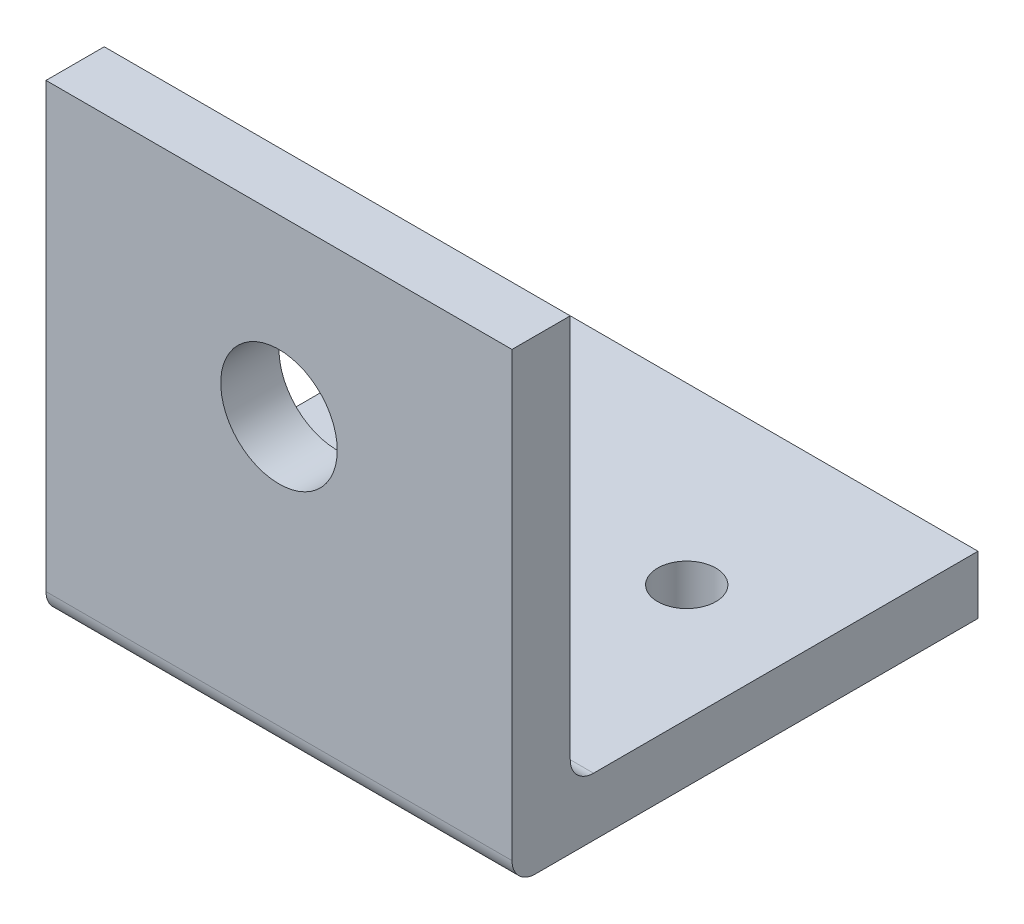
ISO-10303-21;
HEADER;
FILE_DESCRIPTION(('STEP AP214'),'2;1');
FILE_NAME('part.step','',(''),(''),'','','');
FILE_SCHEMA(('AUTOMOTIVE_DESIGN { 1 0 10303 214 1 1 1 1 }'));
ENDSEC;
DATA;
#1=APPLICATION_CONTEXT('core data for automotive mechanical design processes');
#2=APPLICATION_PROTOCOL_DEFINITION('international standard','automotive_design',2000,#1);
#3=PRODUCT_CONTEXT('',#1,'mechanical');
#4=PRODUCT('Part','Part','',(#3));
#5=PRODUCT_RELATED_PRODUCT_CATEGORY('part','',(#4));
#6=PRODUCT_DEFINITION_FORMATION('','',#4);
#7=PRODUCT_DEFINITION_CONTEXT('part definition',#1,'design');
#8=PRODUCT_DEFINITION('design','',#6,#7);
#9=PRODUCT_DEFINITION_SHAPE('','',#8);
#10=(LENGTH_UNIT() NAMED_UNIT(*) SI_UNIT(.MILLI.,.METRE.));
#11=(NAMED_UNIT(*) PLANE_ANGLE_UNIT() SI_UNIT($,.RADIAN.));
#12=(NAMED_UNIT(*) SI_UNIT($,.STERADIAN.) SOLID_ANGLE_UNIT());
#13=UNCERTAINTY_MEASURE_WITH_UNIT(LENGTH_MEASURE(1.E-05),#10,'distance_accuracy_value','');
#14=(GEOMETRIC_REPRESENTATION_CONTEXT(3) GLOBAL_UNCERTAINTY_ASSIGNED_CONTEXT((#13)) GLOBAL_UNIT_ASSIGNED_CONTEXT((#10,
#11,#12)) REPRESENTATION_CONTEXT('',''));
#15=CARTESIAN_POINT('',(0.,0.,0.));
#16=DIRECTION('',(0.,0.,1.));
#17=DIRECTION('',(1.,0.,0.));
#18=AXIS2_PLACEMENT_3D('',#15,#16,#17);
#19=CARTESIAN_POINT('',(40.,38.6433087460485,17.895679662803));
#20=DIRECTION('',(0.,-1.,0.));
#21=DIRECTION('',(0.,0.,-1.));
#22=AXIS2_PLACEMENT_3D('',#19,#20,#21);
#23=PLANE('',#22);
#24=DIRECTION('',(0.,0.,1.));
#25=VECTOR('',#24,1.);
#26=CARTESIAN_POINT('',(0.,38.6433087460485,17.895679662803));
#27=LINE('',#26,#25);
#28=CARTESIAN_POINT('',(0.,38.6433087460485,12.895679662803));
#29=VERTEX_POINT('',#28);
#30=CARTESIAN_POINT('',(0.,38.6433087460485,17.895679662803));
#31=VERTEX_POINT('',#30);
#32=EDGE_CURVE('E137',#29,#31,#27,.T.);
#33=ORIENTED_EDGE('',*,*,#32,.T.);
#34=DIRECTION('',(-1.,0.,0.));
#35=VECTOR('',#34,1.);
#36=CARTESIAN_POINT('',(40.,38.6433087460485,17.895679662803));
#37=LINE('',#36,#35);
#38=CARTESIAN_POINT('',(40.,38.6433087460485,17.895679662803));
#39=VERTEX_POINT('',#38);
#40=EDGE_CURVE('E116',#39,#31,#37,.T.);
#41=ORIENTED_EDGE('',*,*,#40,.F.);
#42=DIRECTION('',(0.,0.,1.));
#43=VECTOR('',#42,1.);
#44=CARTESIAN_POINT('',(40.,38.6433087460485,17.895679662803));
#45=LINE('',#44,#43);
#46=CARTESIAN_POINT('',(40.,38.6433087460485,12.895679662803));
#47=VERTEX_POINT('',#46);
#48=EDGE_CURVE('E124',#47,#39,#45,.T.);
#49=ORIENTED_EDGE('',*,*,#48,.F.);
#50=DIRECTION('',(-1.,0.,0.));
#51=VECTOR('',#50,1.);
#52=CARTESIAN_POINT('',(40.,38.6433087460485,12.895679662803));
#53=LINE('',#52,#51);
#54=EDGE_CURVE('E163',#47,#29,#53,.T.);
#55=ORIENTED_EDGE('',*,*,#54,.T.);
#56=EDGE_LOOP('',(#33,#41,#49,#55));
#57=FACE_BOUND('',#56,.T.);
#58=ADVANCED_FACE('F45',(#57),#23,.F.);
#59=CARTESIAN_POINT('',(40.,38.6433087460485,17.895679662803));
#60=DIRECTION('',(0.,0.,-1.));
#61=DIRECTION('',(0.,1.,0.));
#62=AXIS2_PLACEMENT_3D('',#59,#60,#61);
#63=PLANE('',#62);
#64=CARTESIAN_POINT('',(20.,23.6433087460485,17.895679662803));
#65=DIRECTION('',(0.,0.,1.));
#66=DIRECTION('',(1.,0.,0.));
#67=AXIS2_PLACEMENT_3D('',#64,#65,#66);
#68=CIRCLE('',#67,5.);
#69=CARTESIAN_POINT('',(25.,23.6433087460485,17.895679662803));
#70=VERTEX_POINT('',#69);
#71=EDGE_CURVE('E198',#70,#70,#68,.T.);
#72=ORIENTED_EDGE('',*,*,#71,.F.);
#73=EDGE_LOOP('',(#72));
#74=FACE_BOUND('',#73,.T.);
#75=DIRECTION('',(0.,-1.,0.));
#76=VECTOR('',#75,1.);
#77=CARTESIAN_POINT('',(0.,38.6433087460485,17.895679662803));
#78=LINE('',#77,#76);
#79=CARTESIAN_POINT('',(0.,0.643308746048472,17.895679662803));
#80=VERTEX_POINT('',#79);
#81=EDGE_CURVE('E180',#31,#80,#78,.T.);
#82=ORIENTED_EDGE('',*,*,#81,.T.);
#83=DIRECTION('',(-1.,0.,0.));
#84=VECTOR('',#83,1.);
#85=CARTESIAN_POINT('',(40.,0.643308746048472,17.895679662803));
#86=LINE('',#85,#84);
#87=CARTESIAN_POINT('',(40.,0.643308746048472,17.895679662803));
#88=VERTEX_POINT('',#87);
#89=EDGE_CURVE('E119',#88,#80,#86,.T.);
#90=ORIENTED_EDGE('',*,*,#89,.F.);
#91=DIRECTION('',(0.,-1.,0.));
#92=VECTOR('',#91,1.);
#93=CARTESIAN_POINT('',(40.,38.6433087460485,17.895679662803));
#94=LINE('',#93,#92);
#95=EDGE_CURVE('E112',#39,#88,#94,.T.);
#96=ORIENTED_EDGE('',*,*,#95,.F.);
#97=ORIENTED_EDGE('',*,*,#40,.T.);
#98=EDGE_LOOP('',(#82,#90,#96,#97));
#99=FACE_BOUND('',#98,.T.);
#100=ADVANCED_FACE('F114',(#74,#99),#63,.F.);
#101=CARTESIAN_POINT('',(40.,0.643308746048472,15.895679662803));
#102=DIRECTION('',(-1.,0.,0.));
#103=DIRECTION('',(0.,0.,1.));
#104=AXIS2_PLACEMENT_3D('',#101,#102,#103);
#105=CYLINDRICAL_SURFACE('',#104,2.);
#106=CARTESIAN_POINT('',(0.,0.643308746048472,15.895679662803));
#107=DIRECTION('',(1.,0.,0.));
#108=DIRECTION('',(0.,0.,-1.));
#109=AXIS2_PLACEMENT_3D('',#106,#107,#108);
#110=CIRCLE('',#109,2.);
#111=CARTESIAN_POINT('',(0.,-1.35669125395153,15.895679662803));
#112=VERTEX_POINT('',#111);
#113=EDGE_CURVE('E177',#80,#112,#110,.T.);
#114=ORIENTED_EDGE('',*,*,#113,.T.);
#115=DIRECTION('',(-1.,0.,0.));
#116=VECTOR('',#115,1.);
#117=CARTESIAN_POINT('',(40.,-1.35669125395153,15.895679662803));
#118=LINE('',#117,#116);
#119=CARTESIAN_POINT('',(40.,-1.35669125395153,15.895679662803));
#120=VERTEX_POINT('',#119);
#121=EDGE_CURVE('E145',#120,#112,#118,.T.);
#122=ORIENTED_EDGE('',*,*,#121,.F.);
#123=CARTESIAN_POINT('',(40.,0.643308746048472,15.895679662803));
#124=DIRECTION('',(1.,0.,0.));
#125=DIRECTION('',(0.,0.,-1.));
#126=AXIS2_PLACEMENT_3D('',#123,#124,#125);
#127=CIRCLE('',#126,2.);
#128=EDGE_CURVE('E123',#88,#120,#127,.T.);
#129=ORIENTED_EDGE('',*,*,#128,.F.);
#130=ORIENTED_EDGE('',*,*,#89,.T.);
#131=EDGE_LOOP('',(#114,#122,#129,#130));
#132=FACE_BOUND('',#131,.T.);
#133=ADVANCED_FACE('F246',(#132),#105,.T.);
#134=CARTESIAN_POINT('',(40.,-1.35669125395153,15.895679662803));
#135=DIRECTION('',(0.,1.,0.));
#136=DIRECTION('',(0.,0.,1.));
#137=AXIS2_PLACEMENT_3D('',#134,#135,#136);
#138=PLANE('',#137);
#139=CARTESIAN_POINT('',(10.,-1.35669125395153,-7.10432033719703));
#140=DIRECTION('',(0.,1.,0.));
#141=DIRECTION('',(0.,0.,1.));
#142=AXIS2_PLACEMENT_3D('',#139,#140,#141);
#143=CIRCLE('',#142,2.5);
#144=CARTESIAN_POINT('',(10.,-1.35669125395153,-4.60432033719703));
#145=VERTEX_POINT('',#144);
#146=EDGE_CURVE('E202',#145,#145,#143,.T.);
#147=ORIENTED_EDGE('',*,*,#146,.T.);
#148=EDGE_LOOP('',(#147));
#149=FACE_BOUND('',#148,.T.);
#150=CARTESIAN_POINT('',(30.,-1.35669125395153,-7.10432033719703));
#151=DIRECTION('',(0.,1.,0.));
#152=DIRECTION('',(0.,0.,1.));
#153=AXIS2_PLACEMENT_3D('',#150,#151,#152);
#154=CIRCLE('',#153,2.49999999999999);
#155=CARTESIAN_POINT('',(30.,-1.35669125395153,-4.60432033719704));
#156=VERTEX_POINT('',#155);
#157=EDGE_CURVE('E203',#156,#156,#154,.T.);
#158=ORIENTED_EDGE('',*,*,#157,.T.);
#159=EDGE_LOOP('',(#158));
#160=FACE_BOUND('',#159,.T.);
#161=DIRECTION('',(0.,0.,-1.));
#162=VECTOR('',#161,1.);
#163=CARTESIAN_POINT('',(0.,-1.35669125395153,15.895679662803));
#164=LINE('',#163,#162);
#165=CARTESIAN_POINT('',(0.,-1.35669125395153,-22.104320337197));
#166=VERTEX_POINT('',#165);
#167=EDGE_CURVE('E174',#112,#166,#164,.T.);
#168=ORIENTED_EDGE('',*,*,#167,.T.);
#169=DIRECTION('',(-1.,0.,0.));
#170=VECTOR('',#169,1.);
#171=CARTESIAN_POINT('',(40.,-1.35669125395153,-22.104320337197));
#172=LINE('',#171,#170);
#173=CARTESIAN_POINT('',(40.,-1.35669125395153,-22.104320337197));
#174=VERTEX_POINT('',#173);
#175=EDGE_CURVE('E155',#174,#166,#172,.T.);
#176=ORIENTED_EDGE('',*,*,#175,.F.);
#177=DIRECTION('',(0.,0.,-1.));
#178=VECTOR('',#177,1.);
#179=CARTESIAN_POINT('',(40.,-1.35669125395153,15.895679662803));
#180=LINE('',#179,#178);
#181=EDGE_CURVE('E193',#120,#174,#180,.T.);
#182=ORIENTED_EDGE('',*,*,#181,.F.);
#183=ORIENTED_EDGE('',*,*,#121,.T.);
#184=EDGE_LOOP('',(#168,#176,#182,#183));
#185=FACE_BOUND('',#184,.T.);
#186=ADVANCED_FACE('F219',(#149,#160,#185),#138,.F.);
#187=CARTESIAN_POINT('',(40.,-1.35669125395153,-22.104320337197));
#188=DIRECTION('',(0.,0.,1.));
#189=DIRECTION('',(1.,0.,0.));
#190=AXIS2_PLACEMENT_3D('',#187,#188,#189);
#191=PLANE('',#190);
#192=DIRECTION('',(0.,1.,0.));
#193=VECTOR('',#192,1.);
#194=CARTESIAN_POINT('',(0.,-1.35669125395153,-22.104320337197));
#195=LINE('',#194,#193);
#196=CARTESIAN_POINT('',(0.,3.64330874604847,-22.104320337197));
#197=VERTEX_POINT('',#196);
#198=EDGE_CURVE('E171',#166,#197,#195,.T.);
#199=ORIENTED_EDGE('',*,*,#198,.T.);
#200=DIRECTION('',(-1.,0.,0.));
#201=VECTOR('',#200,1.);
#202=CARTESIAN_POINT('',(40.,3.64330874604847,-22.104320337197));
#203=LINE('',#202,#201);
#204=CARTESIAN_POINT('',(40.,3.64330874604847,-22.104320337197));
#205=VERTEX_POINT('',#204);
#206=EDGE_CURVE('E159',#205,#197,#203,.T.);
#207=ORIENTED_EDGE('',*,*,#206,.F.);
#208=DIRECTION('',(0.,1.,0.));
#209=VECTOR('',#208,1.);
#210=CARTESIAN_POINT('',(40.,-1.35669125395153,-22.104320337197));
#211=LINE('',#210,#209);
#212=EDGE_CURVE('E190',#174,#205,#211,.T.);
#213=ORIENTED_EDGE('',*,*,#212,.F.);
#214=ORIENTED_EDGE('',*,*,#175,.T.);
#215=EDGE_LOOP('',(#199,#207,#213,#214));
#216=FACE_BOUND('',#215,.T.);
#217=ADVANCED_FACE('F233',(#216),#191,.F.);
#218=CARTESIAN_POINT('',(40.,3.64330874604847,12.895679662803));
#219=DIRECTION('',(0.,-1.,0.));
#220=DIRECTION('',(0.,0.,-1.));
#221=AXIS2_PLACEMENT_3D('',#218,#219,#220);
#222=PLANE('',#221);
#223=CARTESIAN_POINT('',(10.,3.64330874604847,-7.10432033719703));
#224=DIRECTION('',(0.,1.,0.));
#225=DIRECTION('',(0.,0.,1.));
#226=AXIS2_PLACEMENT_3D('',#223,#224,#225);
#227=CIRCLE('',#226,2.5);
#228=CARTESIAN_POINT('',(10.,3.64330874604847,-4.60432033719703));
#229=VERTEX_POINT('',#228);
#230=EDGE_CURVE('E211',#229,#229,#227,.T.);
#231=ORIENTED_EDGE('',*,*,#230,.F.);
#232=EDGE_LOOP('',(#231));
#233=FACE_BOUND('',#232,.T.);
#234=CARTESIAN_POINT('',(30.,3.64330874604847,-7.10432033719703));
#235=DIRECTION('',(0.,1.,0.));
#236=DIRECTION('',(0.,0.,1.));
#237=AXIS2_PLACEMENT_3D('',#234,#235,#236);
#238=CIRCLE('',#237,2.49999999999999);
#239=CARTESIAN_POINT('',(30.,3.64330874604847,-4.60432033719704));
#240=VERTEX_POINT('',#239);
#241=EDGE_CURVE('E207',#240,#240,#238,.T.);
#242=ORIENTED_EDGE('',*,*,#241,.F.);
#243=EDGE_LOOP('',(#242));
#244=FACE_BOUND('',#243,.T.);
#245=DIRECTION('',(0.,0.,1.));
#246=VECTOR('',#245,1.);
#247=CARTESIAN_POINT('',(0.,3.64330874604847,12.895679662803));
#248=LINE('',#247,#246);
#249=CARTESIAN_POINT('',(0.,3.64330874604847,10.895679662803));
#250=VERTEX_POINT('',#249);
#251=EDGE_CURVE('E168',#197,#250,#248,.T.);
#252=ORIENTED_EDGE('',*,*,#251,.T.);
#253=DIRECTION('',(-1.,0.,0.));
#254=VECTOR('',#253,1.);
#255=CARTESIAN_POINT('',(40.,3.64330874604847,10.895679662803));
#256=LINE('',#255,#254);
#257=CARTESIAN_POINT('',(40.,3.64330874604847,10.895679662803));
#258=VERTEX_POINT('',#257);
#259=EDGE_CURVE('E62',#250,#258,#256,.F.);
#260=ORIENTED_EDGE('',*,*,#259,.T.);
#261=DIRECTION('',(0.,0.,1.));
#262=VECTOR('',#261,1.);
#263=CARTESIAN_POINT('',(40.,3.64330874604847,12.895679662803));
#264=LINE('',#263,#262);
#265=EDGE_CURVE('E187',#205,#258,#264,.T.);
#266=ORIENTED_EDGE('',*,*,#265,.F.);
#267=ORIENTED_EDGE('',*,*,#206,.T.);
#268=EDGE_LOOP('',(#252,#260,#266,#267));
#269=FACE_BOUND('',#268,.T.);
#270=ADVANCED_FACE('F229',(#233,#244,#269),#222,.F.);
#271=CARTESIAN_POINT('',(40.,38.6433087460485,12.895679662803));
#272=DIRECTION('',(0.,0.,1.));
#273=DIRECTION('',(1.,0.,0.));
#274=AXIS2_PLACEMENT_3D('',#271,#272,#273);
#275=PLANE('',#274);
#276=CARTESIAN_POINT('',(20.,23.6433087460485,12.895679662803));
#277=DIRECTION('',(0.,0.,1.));
#278=DIRECTION('',(1.,0.,0.));
#279=AXIS2_PLACEMENT_3D('',#276,#277,#278);
#280=CIRCLE('',#279,5.);
#281=CARTESIAN_POINT('',(25.,23.6433087460485,12.895679662803));
#282=VERTEX_POINT('',#281);
#283=EDGE_CURVE('E49',#282,#282,#280,.T.);
#284=ORIENTED_EDGE('',*,*,#283,.T.);
#285=EDGE_LOOP('',(#284));
#286=FACE_BOUND('',#285,.T.);
#287=DIRECTION('',(0.,1.,0.));
#288=VECTOR('',#287,1.);
#289=CARTESIAN_POINT('',(40.,38.6433087460485,12.895679662803));
#290=LINE('',#289,#288);
#291=CARTESIAN_POINT('',(40.,5.64330874604847,12.895679662803));
#292=VERTEX_POINT('',#291);
#293=EDGE_CURVE('E129',#292,#47,#290,.T.);
#294=ORIENTED_EDGE('',*,*,#293,.F.);
#295=DIRECTION('',(-1.,0.,0.));
#296=VECTOR('',#295,1.);
#297=CARTESIAN_POINT('',(0.,5.64330874604847,12.895679662803));
#298=LINE('',#297,#296);
#299=CARTESIAN_POINT('',(0.,5.64330874604847,12.895679662803));
#300=VERTEX_POINT('',#299);
#301=EDGE_CURVE('E139',#292,#300,#298,.T.);
#302=ORIENTED_EDGE('',*,*,#301,.T.);
#303=DIRECTION('',(0.,1.,0.));
#304=VECTOR('',#303,1.);
#305=CARTESIAN_POINT('',(0.,38.6433087460485,12.895679662803));
#306=LINE('',#305,#304);
#307=EDGE_CURVE('E134',#300,#29,#306,.T.);
#308=ORIENTED_EDGE('',*,*,#307,.T.);
#309=ORIENTED_EDGE('',*,*,#54,.F.);
#310=EDGE_LOOP('',(#294,#302,#308,#309));
#311=FACE_BOUND('',#310,.T.);
#312=ADVANCED_FACE('F232',(#286,#311),#275,.F.);
#313=CARTESIAN_POINT('',(40.,0.643308746048472,15.895679662803));
#314=DIRECTION('',(1.,0.,0.));
#315=DIRECTION('',(0.,0.,-1.));
#316=AXIS2_PLACEMENT_3D('',#313,#314,#315);
#317=PLANE('',#316);
#318=ORIENTED_EDGE('',*,*,#48,.T.);
#319=ORIENTED_EDGE('',*,*,#95,.T.);
#320=ORIENTED_EDGE('',*,*,#128,.T.);
#321=ORIENTED_EDGE('',*,*,#181,.T.);
#322=ORIENTED_EDGE('',*,*,#212,.T.);
#323=ORIENTED_EDGE('',*,*,#265,.T.);
#324=CARTESIAN_POINT('',(40.,5.64330874604847,10.895679662803));
#325=DIRECTION('',(1.,0.,0.));
#326=DIRECTION('',(0.,0.,-1.));
#327=AXIS2_PLACEMENT_3D('',#324,#325,#326);
#328=CIRCLE('',#327,2.);
#329=EDGE_CURVE('E11',#258,#292,#328,.F.);
#330=ORIENTED_EDGE('',*,*,#329,.T.);
#331=ORIENTED_EDGE('',*,*,#293,.T.);
#332=EDGE_LOOP('',(#318,#319,#320,#321,#322,#323,#330,#331));
#333=FACE_BOUND('',#332,.T.);
#334=ADVANCED_FACE('F127',(#333),#317,.T.);
#335=CARTESIAN_POINT('',(0.,0.643308746048472,15.895679662803));
#336=DIRECTION('',(1.,0.,0.));
#337=DIRECTION('',(0.,0.,-1.));
#338=AXIS2_PLACEMENT_3D('',#335,#336,#337);
#339=PLANE('',#338);
#340=ORIENTED_EDGE('',*,*,#32,.F.);
#341=ORIENTED_EDGE('',*,*,#307,.F.);
#342=CARTESIAN_POINT('',(0.,5.64330874604847,10.895679662803));
#343=DIRECTION('',(1.,0.,0.));
#344=DIRECTION('',(0.,0.,-1.));
#345=AXIS2_PLACEMENT_3D('',#342,#343,#344);
#346=CIRCLE('',#345,2.);
#347=EDGE_CURVE('E55',#300,#250,#346,.T.);
#348=ORIENTED_EDGE('',*,*,#347,.T.);
#349=ORIENTED_EDGE('',*,*,#251,.F.);
#350=ORIENTED_EDGE('',*,*,#198,.F.);
#351=ORIENTED_EDGE('',*,*,#167,.F.);
#352=ORIENTED_EDGE('',*,*,#113,.F.);
#353=ORIENTED_EDGE('',*,*,#81,.F.);
#354=EDGE_LOOP('',(#340,#341,#348,#349,#350,#351,#352,#353));
#355=FACE_BOUND('',#354,.T.);
#356=ADVANCED_FACE('F242',(#355),#339,.F.);
#357=CARTESIAN_POINT('',(40.,5.64330874604847,10.895679662803));
#358=DIRECTION('',(1.,0.,0.));
#359=DIRECTION('',(0.,0.,-1.));
#360=AXIS2_PLACEMENT_3D('',#357,#358,#359);
#361=CYLINDRICAL_SURFACE('',#360,2.);
#362=ORIENTED_EDGE('',*,*,#329,.F.);
#363=ORIENTED_EDGE('',*,*,#259,.F.);
#364=ORIENTED_EDGE('',*,*,#347,.F.);
#365=ORIENTED_EDGE('',*,*,#301,.F.);
#366=EDGE_LOOP('',(#362,#363,#364,#365));
#367=FACE_BOUND('',#366,.T.);
#368=ADVANCED_FACE('F47',(#367),#361,.F.);
#369=CARTESIAN_POINT('',(20.,23.6433087460485,-22.104320337197));
#370=DIRECTION('',(0.,0.,1.));
#371=DIRECTION('',(1.,0.,0.));
#372=AXIS2_PLACEMENT_3D('',#369,#370,#371);
#373=CYLINDRICAL_SURFACE('',#372,5.);
#374=ORIENTED_EDGE('',*,*,#71,.T.);
#375=EDGE_LOOP('',(#374));
#376=FACE_BOUND('',#375,.T.);
#377=ORIENTED_EDGE('',*,*,#283,.F.);
#378=EDGE_LOOP('',(#377));
#379=FACE_BOUND('',#378,.T.);
#380=ADVANCED_FACE('F326',(#376,#379),#373,.F.);
#381=CARTESIAN_POINT('',(30.,-1.35669125395153,-7.10432033719703));
#382=DIRECTION('',(0.,1.,0.));
#383=DIRECTION('',(0.,0.,1.));
#384=AXIS2_PLACEMENT_3D('',#381,#382,#383);
#385=CYLINDRICAL_SURFACE('',#384,2.49999999999999);
#386=ORIENTED_EDGE('',*,*,#157,.F.);
#387=EDGE_LOOP('',(#386));
#388=FACE_BOUND('',#387,.T.);
#389=ORIENTED_EDGE('',*,*,#241,.T.);
#390=EDGE_LOOP('',(#389));
#391=FACE_BOUND('',#390,.T.);
#392=ADVANCED_FACE('F225',(#388,#391),#385,.F.);
#393=CARTESIAN_POINT('',(10.,-1.35669125395153,-7.10432033719703));
#394=DIRECTION('',(0.,1.,0.));
#395=DIRECTION('',(0.,0.,1.));
#396=AXIS2_PLACEMENT_3D('',#393,#394,#395);
#397=CYLINDRICAL_SURFACE('',#396,2.5);
#398=ORIENTED_EDGE('',*,*,#146,.F.);
#399=EDGE_LOOP('',(#398));
#400=FACE_BOUND('',#399,.T.);
#401=ORIENTED_EDGE('',*,*,#230,.T.);
#402=EDGE_LOOP('',(#401));
#403=FACE_BOUND('',#402,.T.);
#404=ADVANCED_FACE('F222',(#400,#403),#397,.F.);
#405=CLOSED_SHELL('',(#58,#100,#133,#186,#217,#270,#312,#334,#356,#368,#380,#392,#404));
#406=MANIFOLD_SOLID_BREP('B2',#405);
#407=ADVANCED_BREP_SHAPE_REPRESENTATION('',(#18,#406),#14);
#408=SHAPE_DEFINITION_REPRESENTATION(#9,#407);
ENDSEC;
END-ISO-10303-21;
